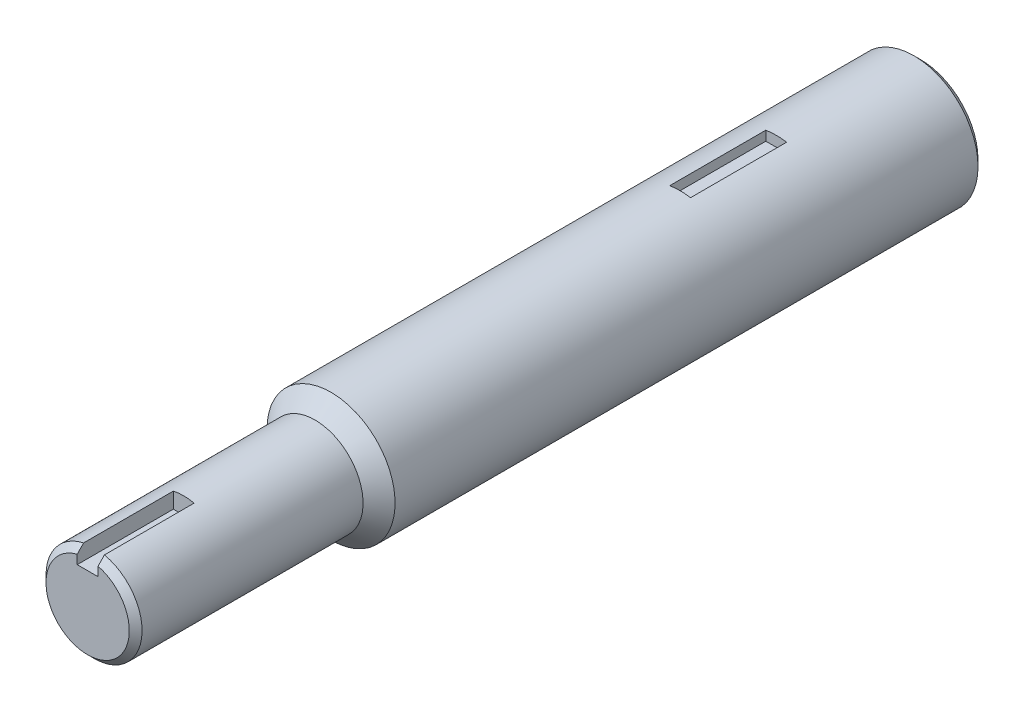
ISO-10303-21;
HEADER;
FILE_DESCRIPTION(('STEP AP214'),'2;1');
FILE_NAME('part.step','',(''),(''),'','','');
FILE_SCHEMA(('AUTOMOTIVE_DESIGN { 1 0 10303 214 1 1 1 1 }'));
ENDSEC;
DATA;
#1=APPLICATION_CONTEXT('core data for automotive mechanical design processes');
#2=APPLICATION_PROTOCOL_DEFINITION('international standard','automotive_design',2000,#1);
#3=PRODUCT_CONTEXT('',#1,'mechanical');
#4=PRODUCT('Part','Part','',(#3));
#5=PRODUCT_RELATED_PRODUCT_CATEGORY('part','',(#4));
#6=PRODUCT_DEFINITION_FORMATION('','',#4);
#7=PRODUCT_DEFINITION_CONTEXT('part definition',#1,'design');
#8=PRODUCT_DEFINITION('design','',#6,#7);
#9=PRODUCT_DEFINITION_SHAPE('','',#8);
#10=(LENGTH_UNIT() NAMED_UNIT(*) SI_UNIT(.MILLI.,.METRE.));
#11=(NAMED_UNIT(*) PLANE_ANGLE_UNIT() SI_UNIT($,.RADIAN.));
#12=(NAMED_UNIT(*) SI_UNIT($,.STERADIAN.) SOLID_ANGLE_UNIT());
#13=UNCERTAINTY_MEASURE_WITH_UNIT(LENGTH_MEASURE(1.E-05),#10,'distance_accuracy_value','');
#14=(GEOMETRIC_REPRESENTATION_CONTEXT(3) GLOBAL_UNCERTAINTY_ASSIGNED_CONTEXT((#13)) GLOBAL_UNIT_ASSIGNED_CONTEXT((#10,
#11,#12)) REPRESENTATION_CONTEXT('',''));
#15=CARTESIAN_POINT('',(0.,0.,0.));
#16=DIRECTION('',(0.,0.,1.));
#17=DIRECTION('',(1.,0.,0.));
#18=AXIS2_PLACEMENT_3D('',#15,#16,#17);
#19=CARTESIAN_POINT('',(0.,0.,-130.));
#20=DIRECTION('',(0.,0.,-1.));
#21=DIRECTION('',(-1.,0.,0.));
#22=AXIS2_PLACEMENT_3D('',#19,#20,#21);
#23=CYLINDRICAL_SURFACE('',#22,10.);
#24=CARTESIAN_POINT('',(0.,0.,-38.0000000000001));
#25=DIRECTION('',(0.,0.,-1.));
#26=DIRECTION('',(-1.,0.,0.));
#27=AXIS2_PLACEMENT_3D('',#24,#25,#26);
#28=CIRCLE('',#27,10.);
#29=CARTESIAN_POINT('',(-10.,0.,-38.0000000000001));
#30=VERTEX_POINT('',#29);
#31=EDGE_CURVE('E43',#30,#30,#28,.T.);
#32=ORIENTED_EDGE('',*,*,#31,.T.);
#33=EDGE_LOOP('',(#32));
#34=FACE_BOUND('',#33,.T.);
#35=CARTESIAN_POINT('',(0.,0.,-129.));
#36=DIRECTION('',(0.,0.,1.));
#37=DIRECTION('',(1.,0.,0.));
#38=AXIS2_PLACEMENT_3D('',#35,#36,#37);
#39=CIRCLE('',#38,10.);
#40=CARTESIAN_POINT('',(10.,0.,-129.));
#41=VERTEX_POINT('',#40);
#42=EDGE_CURVE('E170',#41,#41,#39,.T.);
#43=ORIENTED_EDGE('',*,*,#42,.T.);
#44=EDGE_LOOP('',(#43));
#45=FACE_BOUND('',#44,.T.);
#46=CARTESIAN_POINT('',(0.,0.,-92.5));
#47=DIRECTION('',(0.,0.,-1.));
#48=DIRECTION('',(-1.,0.,0.));
#49=AXIS2_PLACEMENT_3D('',#46,#47,#48);
#50=CIRCLE('',#49,10.);
#51=CARTESIAN_POINT('',(-1.625,9.86708543593295,-92.5));
#52=VERTEX_POINT('',#51);
#53=CARTESIAN_POINT('',(1.625,9.86708543593295,-92.5));
#54=VERTEX_POINT('',#53);
#55=EDGE_CURVE('E182',#52,#54,#50,.T.);
#56=ORIENTED_EDGE('',*,*,#55,.F.);
#57=DIRECTION('',(0.,0.,-1.));
#58=VECTOR('',#57,1.);
#59=CARTESIAN_POINT('',(-1.625,9.86708543593295,-130.));
#60=LINE('',#59,#58);
#61=CARTESIAN_POINT('',(-1.625,9.86708543593295,-107.5));
#62=VERTEX_POINT('',#61);
#63=EDGE_CURVE('E179',#52,#62,#60,.T.);
#64=ORIENTED_EDGE('',*,*,#63,.T.);
#65=CARTESIAN_POINT('',(0.,0.,-107.5));
#66=DIRECTION('',(0.,0.,-1.));
#67=DIRECTION('',(-1.,0.,0.));
#68=AXIS2_PLACEMENT_3D('',#65,#66,#67);
#69=CIRCLE('',#68,10.);
#70=CARTESIAN_POINT('',(1.625,9.86708543593295,-107.5));
#71=VERTEX_POINT('',#70);
#72=EDGE_CURVE('E173',#62,#71,#69,.T.);
#73=ORIENTED_EDGE('',*,*,#72,.T.);
#74=DIRECTION('',(0.,0.,-1.));
#75=VECTOR('',#74,1.);
#76=CARTESIAN_POINT('',(1.625,9.86708543593295,-130.));
#77=LINE('',#76,#75);
#78=EDGE_CURVE('E176',#71,#54,#77,.F.);
#79=ORIENTED_EDGE('',*,*,#78,.T.);
#80=EDGE_LOOP('',(#56,#64,#73,#79));
#81=FACE_BOUND('',#80,.T.);
#82=ADVANCED_FACE('F35',(#34,#45,#81),#23,.T.);
#83=CARTESIAN_POINT('',(10.,0.,-130.));
#84=DIRECTION('',(0.,0.,1.));
#85=DIRECTION('',(1.,0.,0.));
#86=AXIS2_PLACEMENT_3D('',#83,#84,#85);
#87=PLANE('',#86);
#88=CARTESIAN_POINT('',(0.,0.,-130.));
#89=DIRECTION('',(0.,0.,1.));
#90=DIRECTION('',(1.,0.,0.));
#91=AXIS2_PLACEMENT_3D('',#88,#89,#90);
#92=CIRCLE('',#91,9.00000000000002);
#93=CARTESIAN_POINT('',(9.00000000000002,0.,-130.));
#94=VERTEX_POINT('',#93);
#95=EDGE_CURVE('E167',#94,#94,#92,.F.);
#96=ORIENTED_EDGE('',*,*,#95,.T.);
#97=EDGE_LOOP('',(#96));
#98=FACE_BOUND('',#97,.T.);
#99=ADVANCED_FACE('F236',(#98),#87,.F.);
#100=CARTESIAN_POINT('',(0.,0.,-130.));
#101=DIRECTION('',(0.,0.,-1.));
#102=DIRECTION('',(-1.,0.,0.));
#103=AXIS2_PLACEMENT_3D('',#100,#101,#102);
#104=CYLINDRICAL_SURFACE('',#103,7.50000000000001);
#105=CARTESIAN_POINT('',(0.,0.,-35.5));
#106=DIRECTION('',(0.,0.,-1.));
#107=DIRECTION('',(-1.,0.,0.));
#108=AXIS2_PLACEMENT_3D('',#105,#106,#107);
#109=CIRCLE('',#108,7.50000000000001);
#110=CARTESIAN_POINT('',(-7.50000000000001,0.,-35.5));
#111=VERTEX_POINT('',#110);
#112=EDGE_CURVE('E11',#111,#111,#109,.F.);
#113=ORIENTED_EDGE('',*,*,#112,.T.);
#114=EDGE_LOOP('',(#113));
#115=FACE_BOUND('',#114,.T.);
#116=CARTESIAN_POINT('',(0.,0.,-15.));
#117=DIRECTION('',(0.,0.,1.));
#118=DIRECTION('',(1.,0.,0.));
#119=AXIS2_PLACEMENT_3D('',#116,#117,#118);
#120=CIRCLE('',#119,7.50000000000001);
#121=CARTESIAN_POINT('',(1.625,7.32184232280375,-15.));
#122=VERTEX_POINT('',#121);
#123=CARTESIAN_POINT('',(-1.625,7.32184232280375,-15.));
#124=VERTEX_POINT('',#123);
#125=EDGE_CURVE('E113',#122,#124,#120,.T.);
#126=ORIENTED_EDGE('',*,*,#125,.F.);
#127=DIRECTION('',(0.,0.,-1.));
#128=VECTOR('',#127,1.);
#129=CARTESIAN_POINT('',(1.625,7.32184232280375,-130.));
#130=LINE('',#129,#128);
#131=CARTESIAN_POINT('',(1.625,7.32184232280375,-1.));
#132=VERTEX_POINT('',#131);
#133=EDGE_CURVE('E138',#122,#132,#130,.F.);
#134=ORIENTED_EDGE('',*,*,#133,.T.);
#135=CARTESIAN_POINT('',(0.,0.,-1.));
#136=DIRECTION('',(0.,0.,-1.));
#137=DIRECTION('',(-1.,0.,0.));
#138=AXIS2_PLACEMENT_3D('',#135,#136,#137);
#139=CIRCLE('',#138,7.50000000000001);
#140=CARTESIAN_POINT('',(-1.625,7.32184232280375,-1.));
#141=VERTEX_POINT('',#140);
#142=EDGE_CURVE('E159',#132,#141,#139,.T.);
#143=ORIENTED_EDGE('',*,*,#142,.T.);
#144=DIRECTION('',(0.,0.,-1.));
#145=VECTOR('',#144,1.);
#146=CARTESIAN_POINT('',(-1.625,7.32184232280375,-130.));
#147=LINE('',#146,#145);
#148=EDGE_CURVE('E50',#141,#124,#147,.T.);
#149=ORIENTED_EDGE('',*,*,#148,.T.);
#150=EDGE_LOOP('',(#126,#134,#143,#149));
#151=FACE_BOUND('',#150,.T.);
#152=ADVANCED_FACE('F232',(#115,#151),#104,.T.);
#153=CARTESIAN_POINT('',(7.50000000000002,0.,0.));
#154=DIRECTION('',(0.,0.,-1.));
#155=DIRECTION('',(-1.,0.,0.));
#156=AXIS2_PLACEMENT_3D('',#153,#154,#155);
#157=PLANE('',#156);
#158=CARTESIAN_POINT('',(0.,0.,0.));
#159=DIRECTION('',(0.,0.,-1.));
#160=DIRECTION('',(-1.,0.,0.));
#161=AXIS2_PLACEMENT_3D('',#158,#159,#160);
#162=CIRCLE('',#161,6.50000000000001);
#163=CARTESIAN_POINT('',(-1.625,6.29359793758706,0.));
#164=VERTEX_POINT('',#163);
#165=CARTESIAN_POINT('',(1.625,6.29359793758706,0.));
#166=VERTEX_POINT('',#165);
#167=EDGE_CURVE('E164',#164,#166,#162,.F.);
#168=ORIENTED_EDGE('',*,*,#167,.T.);
#169=DIRECTION('',(0.,1.,0.));
#170=VECTOR('',#169,1.);
#171=CARTESIAN_POINT('',(1.625,8.12500000000002,0.));
#172=LINE('',#171,#170);
#173=CARTESIAN_POINT('',(1.625,4.87500000000002,0.));
#174=VERTEX_POINT('',#173);
#175=EDGE_CURVE('E131',#174,#166,#172,.T.);
#176=ORIENTED_EDGE('',*,*,#175,.F.);
#177=DIRECTION('',(1.,0.,0.));
#178=VECTOR('',#177,1.);
#179=CARTESIAN_POINT('',(-1.625,4.87500000000002,0.));
#180=LINE('',#179,#178);
#181=CARTESIAN_POINT('',(-1.625,4.87500000000002,0.));
#182=VERTEX_POINT('',#181);
#183=EDGE_CURVE('E134',#182,#174,#180,.T.);
#184=ORIENTED_EDGE('',*,*,#183,.F.);
#185=DIRECTION('',(0.,-1.,0.));
#186=VECTOR('',#185,1.);
#187=CARTESIAN_POINT('',(-1.625,8.12500000000002,0.));
#188=LINE('',#187,#186);
#189=EDGE_CURVE('E120',#164,#182,#188,.T.);
#190=ORIENTED_EDGE('',*,*,#189,.F.);
#191=EDGE_LOOP('',(#168,#176,#184,#190));
#192=FACE_BOUND('',#191,.T.);
#193=ADVANCED_FACE('F229',(#192),#157,.F.);
#194=CARTESIAN_POINT('',(0.,0.,-1.));
#195=DIRECTION('',(0.,0.,-1.));
#196=DIRECTION('',(-1.,0.,0.));
#197=AXIS2_PLACEMENT_3D('',#194,#195,#196);
#198=CONICAL_SURFACE('',#197,7.50000000000001,0.785398163397452);
#199=CARTESIAN_POINT('',(1.625,2.56377223795902,3.46461648417708));
#200=CARTESIAN_POINT('',(1.625,2.6770856603764,3.36885089675363));
#201=CARTESIAN_POINT('',(1.625,2.78955395822704,3.27209900463959));
#202=CARTESIAN_POINT('',(1.625,3.01313674941909,3.07705748130542));
#203=CARTESIAN_POINT('',(1.625,3.1242513387398,2.97876796024671));
#204=CARTESIAN_POINT('',(1.625,3.34546082729118,2.78108870549228));
#205=CARTESIAN_POINT('',(1.625,3.45555589301933,2.68169915747554));
#206=CARTESIAN_POINT('',(1.625,3.67496103178045,2.48205355102424));
#207=CARTESIAN_POINT('',(1.625,3.78427108862228,2.3817974748106));
#208=CARTESIAN_POINT('',(1.625,4.11121937080393,2.08008430319406));
#209=CARTESIAN_POINT('',(1.625,4.32793535814193,1.87762855387604));
#210=CARTESIAN_POINT('',(1.625,4.75976848276466,1.47100568416193));
#211=CARTESIAN_POINT('',(1.625,4.97488554961852,1.26683848921135));
#212=CARTESIAN_POINT('',(1.625,5.31239780123186,0.944744993759856));
#213=CARTESIAN_POINT('',(1.625,5.43516973621598,0.827213053304676));
#214=CARTESIAN_POINT('',(1.625,5.68040572086251,0.591831988588396));
#215=CARTESIAN_POINT('',(1.625,5.8028697749453,0.473982868932064));
#216=CARTESIAN_POINT('',(1.625,6.1699004023584,0.120024043256783));
#217=CARTESIAN_POINT('',(1.625,6.41408705995458,-0.116479554859464));
#218=CARTESIAN_POINT('',(1.625,6.99249385531196,-0.678390646860395));
#219=CARTESIAN_POINT('',(1.625,7.32639655248911,-1.00412462643591));
#220=CARTESIAN_POINT('',(1.625,7.99330022547841,-1.65651422925189));
#221=CARTESIAN_POINT('',(1.625,8.32630120045811,-1.98316985334263));
#222=CARTESIAN_POINT('',(1.625,8.9916038632042,-2.63705533824269));
#223=CARTESIAN_POINT('',(1.625,9.32390568079463,-2.9642850670207));
#224=CARTESIAN_POINT('',(1.625,9.98803772849752,-3.61921968162932));
#225=CARTESIAN_POINT('',(1.625,10.3198679608259,-3.9469245652125));
#226=CARTESIAN_POINT('',(1.625,10.6515434484356,-4.27478551219977));
#227=B_SPLINE_CURVE_WITH_KNOTS('',3,(#199,#200,#201,#202,#203,#204,#205,#206,#207,#208,#209,
#210,#211,#212,#213,#214,#215,#216,#217,#218,#219,#220,#221,#222,#223,#224,#225,#226),
.UNSPECIFIED.,.F.,.F.,(4,2,2,2,2,2,2,2,2,2,2,2,2,4),(0.,0.445064600637375,0.890097459919404,
1.33505631206306,1.7800243154615,2.66971953643968,3.55945371809554,4.06933581939733,
4.57921055780025,5.59903632618418,6.9984415872239,8.39784813971982,9.79696665815099,
11.1960785803767),.UNSPECIFIED.);
#228=EDGE_CURVE('E191',#166,#132,#227,.T.);
#229=ORIENTED_EDGE('',*,*,#228,.F.);
#230=ORIENTED_EDGE('',*,*,#167,.F.);
#231=CARTESIAN_POINT('',(-1.625,10.6515434484356,-4.27478551219977));
#232=CARTESIAN_POINT('',(-1.625,10.3198004177069,-3.94685729821966));
#233=CARTESIAN_POINT('',(-1.625,9.98790223198787,-3.61908562197418));
#234=CARTESIAN_POINT('',(-1.625,9.32364448805479,-2.9640279385584));
#235=CARTESIAN_POINT('',(-1.625,8.99128494239683,-2.63674191865363));
#236=CARTESIAN_POINT('',(-1.625,8.32599236039592,-1.98286628294686));
#237=CARTESIAN_POINT('',(-1.625,7.99305943133466,-1.6562765580587));
#238=CARTESIAN_POINT('',(-1.625,7.32627953991031,-1.00401228054046));
#239=CARTESIAN_POINT('',(-1.625,6.99243255192376,-0.678337754095261));
#240=CARTESIAN_POINT('',(-1.625,6.32330340982436,-0.0282783183359666));
#241=CARTESIAN_POINT('',(-1.625,5.98802088470915,0.296106209850308));
#242=CARTESIAN_POINT('',(-1.625,5.48348721402779,0.780984772955467));
#243=CARTESIAN_POINT('',(-1.625,5.31504697416389,0.942322266845078));
#244=CARTESIAN_POINT('',(-1.625,4.97745132275332,1.26425282762715));
#245=CARTESIAN_POINT('',(-1.625,4.80829590110281,1.42484588393482));
#246=CARTESIAN_POINT('',(-1.625,4.46899185435896,1.74506926915805));
#247=CARTESIAN_POINT('',(-1.625,4.29884298109919,1.904699335326));
#248=CARTESIAN_POINT('',(-1.625,3.95724965890625,2.22255781542578));
#249=CARTESIAN_POINT('',(-1.625,3.78580526100029,2.38078628403499));
#250=CARTESIAN_POINT('',(-1.625,3.52721970313789,2.61661667068878));
#251=CARTESIAN_POINT('',(-1.625,3.44077718873449,2.69498439563688));
#252=CARTESIAN_POINT('',(-1.625,3.26732182485663,2.8510842674213));
#253=CARTESIAN_POINT('',(-1.625,3.18030898303625,2.92881642275595));
#254=CARTESIAN_POINT('',(-1.625,3.00557434077115,3.08350495753049));
#255=CARTESIAN_POINT('',(-1.625,2.91785244828853,3.16046123324668));
#256=CARTESIAN_POINT('',(-1.625,2.74152231515318,3.3133589719791));
#257=CARTESIAN_POINT('',(-1.625,2.65291403366701,3.38930038786367));
#258=CARTESIAN_POINT('',(-1.625,2.56377223795902,3.46461648417708));
#259=B_SPLINE_CURVE_WITH_KNOTS('',3,(#231,#232,#233,#234,#235,#236,#237,#238,#239,#240,#241,
#242,#243,#244,#245,#246,#247,#248,#249,#250,#251,#252,#253,#254,#255,#256,#257,#258),
.UNSPECIFIED.,.F.,.F.,(4,2,2,2,2,2,2,2,2,2,2,2,2,4),(0.,1.39939781273979,2.79875825927764,
4.19788044135787,5.59704225446759,6.99659060272924,7.69631546197481,8.39605023992794,
9.09596800699723,9.79585834842235,10.1458905633275,10.495918090199,10.8459918061453,
11.1960817239492),.UNSPECIFIED.);
#260=EDGE_CURVE('E184',#141,#164,#259,.T.);
#261=ORIENTED_EDGE('',*,*,#260,.F.);
#262=ORIENTED_EDGE('',*,*,#142,.F.);
#263=EDGE_LOOP('',(#229,#230,#261,#262));
#264=FACE_BOUND('',#263,.T.);
#265=ADVANCED_FACE('F197',(#264),#198,.T.);
#266=CARTESIAN_POINT('',(0.,0.,-130.));
#267=DIRECTION('',(0.,0.,1.));
#268=DIRECTION('',(1.,0.,0.));
#269=AXIS2_PLACEMENT_3D('',#266,#267,#268);
#270=CONICAL_SURFACE('',#269,9.00000000000002,0.78539816339744);
#271=ORIENTED_EDGE('',*,*,#42,.F.);
#272=EDGE_LOOP('',(#271));
#273=FACE_BOUND('',#272,.T.);
#274=ORIENTED_EDGE('',*,*,#95,.F.);
#275=EDGE_LOOP('',(#274));
#276=FACE_BOUND('',#275,.T.);
#277=ADVANCED_FACE('F227',(#273,#276),#270,.T.);
#278=CARTESIAN_POINT('',(-1.625,11.625,-92.5));
#279=DIRECTION('',(-1.,0.,0.));
#280=DIRECTION('',(0.,0.,1.));
#281=AXIS2_PLACEMENT_3D('',#278,#279,#280);
#282=PLANE('',#281);
#283=DIRECTION('',(0.,1.,0.));
#284=VECTOR('',#283,1.);
#285=CARTESIAN_POINT('',(-1.625,11.625,-92.5));
#286=LINE('',#285,#284);
#287=CARTESIAN_POINT('',(-1.625,8.375,-92.5));
#288=VERTEX_POINT('',#287);
#289=EDGE_CURVE('E142',#288,#52,#286,.T.);
#290=ORIENTED_EDGE('',*,*,#289,.F.);
#291=DIRECTION('',(0.,0.,-1.));
#292=VECTOR('',#291,1.);
#293=CARTESIAN_POINT('',(-1.625,8.375,-92.5));
#294=LINE('',#293,#292);
#295=CARTESIAN_POINT('',(-1.625,8.375,-107.5));
#296=VERTEX_POINT('',#295);
#297=EDGE_CURVE('E157',#288,#296,#294,.T.);
#298=ORIENTED_EDGE('',*,*,#297,.T.);
#299=DIRECTION('',(0.,1.,0.));
#300=VECTOR('',#299,1.);
#301=CARTESIAN_POINT('',(-1.625,11.625,-107.5));
#302=LINE('',#301,#300);
#303=EDGE_CURVE('E141',#296,#62,#302,.T.);
#304=ORIENTED_EDGE('',*,*,#303,.T.);
#305=ORIENTED_EDGE('',*,*,#63,.F.);
#306=EDGE_LOOP('',(#290,#298,#304,#305));
#307=FACE_BOUND('',#306,.T.);
#308=ADVANCED_FACE('F223',(#307),#282,.F.);
#309=CARTESIAN_POINT('',(1.625,11.625,-92.5));
#310=DIRECTION('',(1.,0.,0.));
#311=DIRECTION('',(0.,0.,-1.));
#312=AXIS2_PLACEMENT_3D('',#309,#310,#311);
#313=PLANE('',#312);
#314=DIRECTION('',(0.,-1.,0.));
#315=VECTOR('',#314,1.);
#316=CARTESIAN_POINT('',(1.625,11.625,-107.5));
#317=LINE('',#316,#315);
#318=CARTESIAN_POINT('',(1.625,8.375,-107.5));
#319=VERTEX_POINT('',#318);
#320=EDGE_CURVE('E58',#71,#319,#317,.T.);
#321=ORIENTED_EDGE('',*,*,#320,.T.);
#322=DIRECTION('',(0.,0.,-1.));
#323=VECTOR('',#322,1.);
#324=CARTESIAN_POINT('',(1.625,8.375,-92.5));
#325=LINE('',#324,#323);
#326=CARTESIAN_POINT('',(1.625,8.375,-92.5));
#327=VERTEX_POINT('',#326);
#328=EDGE_CURVE('E151',#327,#319,#325,.T.);
#329=ORIENTED_EDGE('',*,*,#328,.F.);
#330=DIRECTION('',(0.,-1.,0.));
#331=VECTOR('',#330,1.);
#332=CARTESIAN_POINT('',(1.625,11.625,-92.5));
#333=LINE('',#332,#331);
#334=EDGE_CURVE('E145',#54,#327,#333,.T.);
#335=ORIENTED_EDGE('',*,*,#334,.F.);
#336=ORIENTED_EDGE('',*,*,#78,.F.);
#337=EDGE_LOOP('',(#321,#329,#335,#336));
#338=FACE_BOUND('',#337,.T.);
#339=ADVANCED_FACE('F213',(#338),#313,.F.);
#340=CARTESIAN_POINT('',(0.,0.,-92.5));
#341=DIRECTION('',(0.,0.,-1.));
#342=DIRECTION('',(-1.,0.,0.));
#343=AXIS2_PLACEMENT_3D('',#340,#341,#342);
#344=PLANE('',#343);
#345=ORIENTED_EDGE('',*,*,#55,.T.);
#346=ORIENTED_EDGE('',*,*,#334,.T.);
#347=DIRECTION('',(-1.,0.,0.));
#348=VECTOR('',#347,1.);
#349=CARTESIAN_POINT('',(1.625,8.375,-92.5));
#350=LINE('',#349,#348);
#351=EDGE_CURVE('E148',#327,#288,#350,.T.);
#352=ORIENTED_EDGE('',*,*,#351,.T.);
#353=ORIENTED_EDGE('',*,*,#289,.T.);
#354=EDGE_LOOP('',(#345,#346,#352,#353));
#355=FACE_BOUND('',#354,.T.);
#356=ADVANCED_FACE('F209',(#355),#344,.T.);
#357=CARTESIAN_POINT('',(0.,0.,-107.5));
#358=DIRECTION('',(0.,0.,-1.));
#359=DIRECTION('',(-1.,0.,0.));
#360=AXIS2_PLACEMENT_3D('',#357,#358,#359);
#361=PLANE('',#360);
#362=ORIENTED_EDGE('',*,*,#303,.F.);
#363=DIRECTION('',(-1.,0.,0.));
#364=VECTOR('',#363,1.);
#365=CARTESIAN_POINT('',(1.625,8.375,-107.5));
#366=LINE('',#365,#364);
#367=EDGE_CURVE('E146',#319,#296,#366,.T.);
#368=ORIENTED_EDGE('',*,*,#367,.F.);
#369=ORIENTED_EDGE('',*,*,#320,.F.);
#370=ORIENTED_EDGE('',*,*,#72,.F.);
#371=EDGE_LOOP('',(#362,#368,#369,#370));
#372=FACE_BOUND('',#371,.T.);
#373=ADVANCED_FACE('F212',(#372),#361,.F.);
#374=CARTESIAN_POINT('',(1.625,8.375,-92.5));
#375=DIRECTION('',(0.,-1.,0.));
#376=DIRECTION('',(0.,0.,-1.));
#377=AXIS2_PLACEMENT_3D('',#374,#375,#376);
#378=PLANE('',#377);
#379=ORIENTED_EDGE('',*,*,#367,.T.);
#380=ORIENTED_EDGE('',*,*,#297,.F.);
#381=ORIENTED_EDGE('',*,*,#351,.F.);
#382=ORIENTED_EDGE('',*,*,#328,.T.);
#383=EDGE_LOOP('',(#379,#380,#381,#382));
#384=FACE_BOUND('',#383,.T.);
#385=ADVANCED_FACE('F217',(#384),#378,.F.);
#386=CARTESIAN_POINT('',(0.,0.,-15.));
#387=DIRECTION('',(0.,0.,1.));
#388=DIRECTION('',(1.,0.,0.));
#389=AXIS2_PLACEMENT_3D('',#386,#387,#388);
#390=PLANE('',#389);
#391=ORIENTED_EDGE('',*,*,#125,.T.);
#392=DIRECTION('',(0.,-1.,0.));
#393=VECTOR('',#392,1.);
#394=CARTESIAN_POINT('',(-1.625,8.12500000000002,-15.));
#395=LINE('',#394,#393);
#396=CARTESIAN_POINT('',(-1.625,4.87500000000002,-15.));
#397=VERTEX_POINT('',#396);
#398=EDGE_CURVE('E106',#124,#397,#395,.T.);
#399=ORIENTED_EDGE('',*,*,#398,.T.);
#400=DIRECTION('',(1.,0.,0.));
#401=VECTOR('',#400,1.);
#402=CARTESIAN_POINT('',(-1.625,4.87500000000002,-15.));
#403=LINE('',#402,#401);
#404=CARTESIAN_POINT('',(1.625,4.87500000000002,-15.));
#405=VERTEX_POINT('',#404);
#406=EDGE_CURVE('E111',#397,#405,#403,.T.);
#407=ORIENTED_EDGE('',*,*,#406,.T.);
#408=DIRECTION('',(0.,1.,0.));
#409=VECTOR('',#408,1.);
#410=CARTESIAN_POINT('',(1.625,8.12500000000002,-15.));
#411=LINE('',#410,#409);
#412=EDGE_CURVE('E114',#405,#122,#411,.T.);
#413=ORIENTED_EDGE('',*,*,#412,.T.);
#414=EDGE_LOOP('',(#391,#399,#407,#413));
#415=FACE_BOUND('',#414,.T.);
#416=ADVANCED_FACE('F108',(#415),#390,.T.);
#417=CARTESIAN_POINT('',(1.625,8.12500000000002,-15.));
#418=DIRECTION('',(1.,0.,0.));
#419=DIRECTION('',(0.,1.,0.));
#420=AXIS2_PLACEMENT_3D('',#417,#418,#419);
#421=PLANE('',#420);
#422=ORIENTED_EDGE('',*,*,#412,.F.);
#423=DIRECTION('',(0.,0.,1.));
#424=VECTOR('',#423,1.);
#425=CARTESIAN_POINT('',(1.625,4.87500000000002,-15.));
#426=LINE('',#425,#424);
#427=EDGE_CURVE('E124',#405,#174,#426,.T.);
#428=ORIENTED_EDGE('',*,*,#427,.T.);
#429=ORIENTED_EDGE('',*,*,#175,.T.);
#430=ORIENTED_EDGE('',*,*,#228,.T.);
#431=ORIENTED_EDGE('',*,*,#133,.F.);
#432=EDGE_LOOP('',(#422,#428,#429,#430,#431));
#433=FACE_BOUND('',#432,.T.);
#434=ADVANCED_FACE('F203',(#433),#421,.F.);
#435=CARTESIAN_POINT('',(-1.625,8.12500000000002,-15.));
#436=DIRECTION('',(-1.,0.,0.));
#437=DIRECTION('',(0.,-1.,0.));
#438=AXIS2_PLACEMENT_3D('',#435,#436,#437);
#439=PLANE('',#438);
#440=ORIENTED_EDGE('',*,*,#260,.T.);
#441=ORIENTED_EDGE('',*,*,#189,.T.);
#442=DIRECTION('',(0.,0.,1.));
#443=VECTOR('',#442,1.);
#444=CARTESIAN_POINT('',(-1.625,4.87500000000002,-15.));
#445=LINE('',#444,#443);
#446=EDGE_CURVE('E117',#397,#182,#445,.T.);
#447=ORIENTED_EDGE('',*,*,#446,.F.);
#448=ORIENTED_EDGE('',*,*,#398,.F.);
#449=ORIENTED_EDGE('',*,*,#148,.F.);
#450=EDGE_LOOP('',(#440,#441,#447,#448,#449));
#451=FACE_BOUND('',#450,.T.);
#452=ADVANCED_FACE('F118',(#451),#439,.F.);
#453=CARTESIAN_POINT('',(-1.625,4.87500000000002,-15.));
#454=DIRECTION('',(0.,-1.,0.));
#455=DIRECTION('',(0.,0.,-1.));
#456=AXIS2_PLACEMENT_3D('',#453,#454,#455);
#457=PLANE('',#456);
#458=ORIENTED_EDGE('',*,*,#183,.T.);
#459=ORIENTED_EDGE('',*,*,#427,.F.);
#460=ORIENTED_EDGE('',*,*,#406,.F.);
#461=ORIENTED_EDGE('',*,*,#446,.T.);
#462=EDGE_LOOP('',(#458,#459,#460,#461));
#463=FACE_BOUND('',#462,.T.);
#464=ADVANCED_FACE('F126',(#463),#457,.F.);
#465=CARTESIAN_POINT('',(0.,0.,-38.0000000000001));
#466=DIRECTION('',(0.,0.,-1.));
#467=DIRECTION('',(-1.,0.,0.));
#468=AXIS2_PLACEMENT_3D('',#465,#466,#467);
#469=CONICAL_SURFACE('',#468,10.,0.785398163397442);
#470=ORIENTED_EDGE('',*,*,#112,.F.);
#471=EDGE_LOOP('',(#470));
#472=FACE_BOUND('',#471,.T.);
#473=ORIENTED_EDGE('',*,*,#31,.F.);
#474=EDGE_LOOP('',(#473));
#475=FACE_BOUND('',#474,.T.);
#476=ADVANCED_FACE('F37',(#472,#475),#469,.T.);
#477=CLOSED_SHELL('',(#82,#99,#152,#193,#265,#277,#308,#339,#356,#373,#385,#416,#434,#452,#464,#476));
#478=MANIFOLD_SOLID_BREP('B2',#477);
#479=ADVANCED_BREP_SHAPE_REPRESENTATION('',(#18,#478),#14);
#480=SHAPE_DEFINITION_REPRESENTATION(#9,#479);
ENDSEC;
END-ISO-10303-21;
